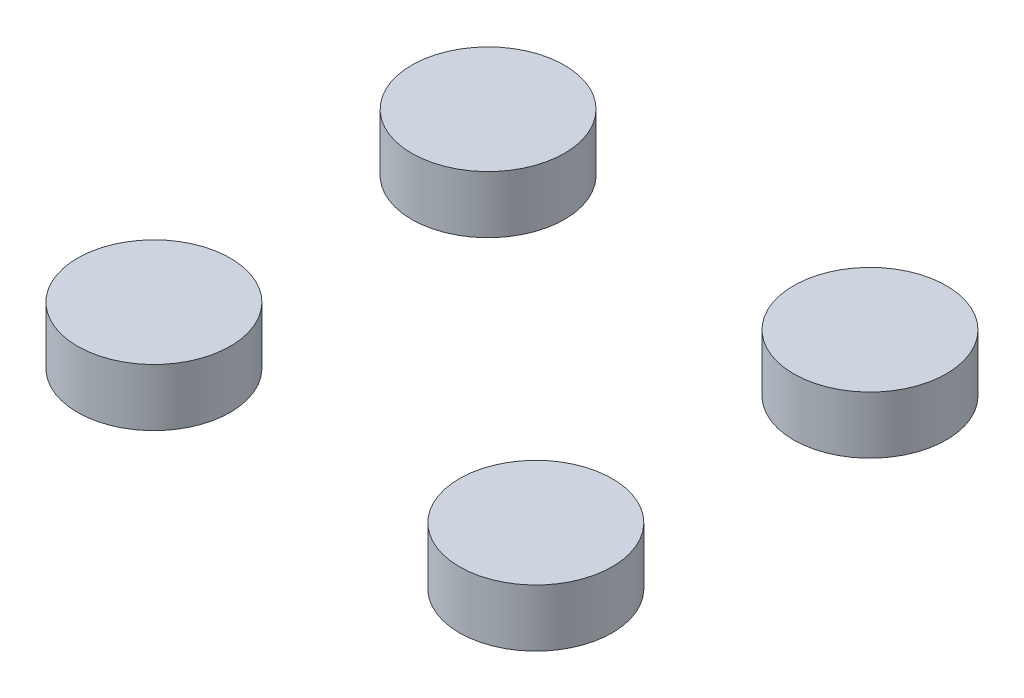
ISO-10303-21;
HEADER;
FILE_DESCRIPTION(('STEP AP214'),'2;1');
FILE_NAME('part.step','',(''),(''),'','','');
FILE_SCHEMA(('AUTOMOTIVE_DESIGN { 1 0 10303 214 1 1 1 1 }'));
ENDSEC;
DATA;
#1=APPLICATION_CONTEXT('core data for automotive mechanical design processes');
#2=APPLICATION_PROTOCOL_DEFINITION('international standard','automotive_design',2000,#1);
#3=PRODUCT_CONTEXT('',#1,'mechanical');
#4=PRODUCT('Part','Part','',(#3));
#5=PRODUCT_RELATED_PRODUCT_CATEGORY('part','',(#4));
#6=PRODUCT_DEFINITION_FORMATION('','',#4);
#7=PRODUCT_DEFINITION_CONTEXT('part definition',#1,'design');
#8=PRODUCT_DEFINITION('design','',#6,#7);
#9=PRODUCT_DEFINITION_SHAPE('','',#8);
#10=(LENGTH_UNIT() NAMED_UNIT(*) SI_UNIT(.MILLI.,.METRE.));
#11=(NAMED_UNIT(*) PLANE_ANGLE_UNIT() SI_UNIT($,.RADIAN.));
#12=(NAMED_UNIT(*) SI_UNIT($,.STERADIAN.) SOLID_ANGLE_UNIT());
#13=UNCERTAINTY_MEASURE_WITH_UNIT(LENGTH_MEASURE(1.E-05),#10,'distance_accuracy_value','');
#14=(GEOMETRIC_REPRESENTATION_CONTEXT(3) GLOBAL_UNCERTAINTY_ASSIGNED_CONTEXT((#13)) GLOBAL_UNIT_ASSIGNED_CONTEXT((#10,
#11,#12)) REPRESENTATION_CONTEXT('',''));
#15=CARTESIAN_POINT('',(0.,0.,0.));
#16=DIRECTION('',(0.,0.,1.));
#17=DIRECTION('',(1.,0.,0.));
#18=AXIS2_PLACEMENT_3D('',#15,#16,#17);
#19=CARTESIAN_POINT('',(400.,1560.,350.));
#20=DIRECTION('',(0.,-1.,0.));
#21=DIRECTION('',(0.,0.,-1.));
#22=AXIS2_PLACEMENT_3D('',#19,#20,#21);
#23=CYLINDRICAL_SURFACE('',#22,160.);
#24=CARTESIAN_POINT('',(400.,1560.,350.));
#25=DIRECTION('',(0.,1.,0.));
#26=DIRECTION('',(0.,0.,1.));
#27=AXIS2_PLACEMENT_3D('',#24,#25,#26);
#28=CIRCLE('',#27,160.);
#29=CARTESIAN_POINT('',(400.,1560.,510.));
#30=VERTEX_POINT('',#29);
#31=EDGE_CURVE('E11',#30,#30,#28,.T.);
#32=ORIENTED_EDGE('',*,*,#31,.F.);
#33=EDGE_LOOP('',(#32));
#34=FACE_BOUND('',#33,.T.);
#35=CARTESIAN_POINT('',(400.,1440.,350.));
#36=DIRECTION('',(0.,1.,0.));
#37=DIRECTION('',(0.,0.,1.));
#38=AXIS2_PLACEMENT_3D('',#35,#36,#37);
#39=CIRCLE('',#38,160.);
#40=CARTESIAN_POINT('',(400.,1440.,510.));
#41=VERTEX_POINT('',#40);
#42=EDGE_CURVE('E47',#41,#41,#39,.T.);
#43=ORIENTED_EDGE('',*,*,#42,.T.);
#44=EDGE_LOOP('',(#43));
#45=FACE_BOUND('',#44,.T.);
#46=ADVANCED_FACE('F46',(#34,#45),#23,.T.);
#47=CARTESIAN_POINT('',(400.,1560.,350.));
#48=DIRECTION('',(0.,1.,0.));
#49=DIRECTION('',(0.,0.,1.));
#50=AXIS2_PLACEMENT_3D('',#47,#48,#49);
#51=PLANE('',#50);
#52=ORIENTED_EDGE('',*,*,#31,.T.);
#53=EDGE_LOOP('',(#52));
#54=FACE_BOUND('',#53,.T.);
#55=ADVANCED_FACE('F61',(#54),#51,.T.);
#56=CARTESIAN_POINT('',(400.,1440.,350.));
#57=DIRECTION('',(0.,1.,0.));
#58=DIRECTION('',(0.,0.,1.));
#59=AXIS2_PLACEMENT_3D('',#56,#57,#58);
#60=PLANE('',#59);
#61=ORIENTED_EDGE('',*,*,#42,.F.);
#62=EDGE_LOOP('',(#61));
#63=FACE_BOUND('',#62,.T.);
#64=ADVANCED_FACE('F56',(#63),#60,.F.);
#65=CLOSED_SHELL('',(#46,#55,#64));
#66=MANIFOLD_SOLID_BREP('B2',#65);
#67=CARTESIAN_POINT('',(400.,1560.,-350.));
#68=DIRECTION('',(0.,-1.,0.));
#69=DIRECTION('',(0.,0.,-1.));
#70=AXIS2_PLACEMENT_3D('',#67,#68,#69);
#71=CYLINDRICAL_SURFACE('',#70,160.);
#72=CARTESIAN_POINT('',(400.,1560.,-350.));
#73=DIRECTION('',(0.,1.,0.));
#74=DIRECTION('',(0.,0.,1.));
#75=AXIS2_PLACEMENT_3D('',#72,#73,#74);
#76=CIRCLE('',#75,160.);
#77=CARTESIAN_POINT('',(400.,1560.,-190.));
#78=VERTEX_POINT('',#77);
#79=EDGE_CURVE('E44',#78,#78,#76,.T.);
#80=ORIENTED_EDGE('',*,*,#79,.F.);
#81=EDGE_LOOP('',(#80));
#82=FACE_BOUND('',#81,.T.);
#83=CARTESIAN_POINT('',(400.,1440.,-350.));
#84=DIRECTION('',(0.,1.,0.));
#85=DIRECTION('',(0.,0.,1.));
#86=AXIS2_PLACEMENT_3D('',#83,#84,#85);
#87=CIRCLE('',#86,160.);
#88=CARTESIAN_POINT('',(400.,1440.,-190.));
#89=VERTEX_POINT('',#88);
#90=EDGE_CURVE('E98',#89,#89,#87,.T.);
#91=ORIENTED_EDGE('',*,*,#90,.T.);
#92=EDGE_LOOP('',(#91));
#93=FACE_BOUND('',#92,.T.);
#94=ADVANCED_FACE('F92',(#82,#93),#71,.T.);
#95=CARTESIAN_POINT('',(400.,1560.,-350.));
#96=DIRECTION('',(0.,1.,0.));
#97=DIRECTION('',(0.,0.,1.));
#98=AXIS2_PLACEMENT_3D('',#95,#96,#97);
#99=PLANE('',#98);
#100=ORIENTED_EDGE('',*,*,#79,.T.);
#101=EDGE_LOOP('',(#100));
#102=FACE_BOUND('',#101,.T.);
#103=ADVANCED_FACE('F109',(#102),#99,.T.);
#104=CARTESIAN_POINT('',(400.,1440.,-350.));
#105=DIRECTION('',(0.,1.,0.));
#106=DIRECTION('',(0.,0.,1.));
#107=AXIS2_PLACEMENT_3D('',#104,#105,#106);
#108=PLANE('',#107);
#109=ORIENTED_EDGE('',*,*,#90,.F.);
#110=EDGE_LOOP('',(#109));
#111=FACE_BOUND('',#110,.T.);
#112=ADVANCED_FACE('F107',(#111),#108,.F.);
#113=CLOSED_SHELL('',(#94,#103,#112));
#114=MANIFOLD_SOLID_BREP('B6',#113);
#115=CARTESIAN_POINT('',(-400.,1560.,350.));
#116=DIRECTION('',(0.,-1.,0.));
#117=DIRECTION('',(0.,0.,-1.));
#118=AXIS2_PLACEMENT_3D('',#115,#116,#117);
#119=CYLINDRICAL_SURFACE('',#118,160.);
#120=CARTESIAN_POINT('',(-400.,1560.,350.));
#121=DIRECTION('',(0.,1.,0.));
#122=DIRECTION('',(0.,0.,1.));
#123=AXIS2_PLACEMENT_3D('',#120,#121,#122);
#124=CIRCLE('',#123,160.);
#125=CARTESIAN_POINT('',(-400.,1560.,510.));
#126=VERTEX_POINT('',#125);
#127=EDGE_CURVE('E94',#126,#126,#124,.T.);
#128=ORIENTED_EDGE('',*,*,#127,.F.);
#129=EDGE_LOOP('',(#128));
#130=FACE_BOUND('',#129,.T.);
#131=CARTESIAN_POINT('',(-400.,1440.,350.));
#132=DIRECTION('',(0.,1.,0.));
#133=DIRECTION('',(0.,0.,1.));
#134=AXIS2_PLACEMENT_3D('',#131,#132,#133);
#135=CIRCLE('',#134,160.);
#136=CARTESIAN_POINT('',(-400.,1440.,510.));
#137=VERTEX_POINT('',#136);
#138=EDGE_CURVE('E148',#137,#137,#135,.T.);
#139=ORIENTED_EDGE('',*,*,#138,.T.);
#140=EDGE_LOOP('',(#139));
#141=FACE_BOUND('',#140,.T.);
#142=ADVANCED_FACE('F141',(#130,#141),#119,.T.);
#143=CARTESIAN_POINT('',(-400.,1560.,350.));
#144=DIRECTION('',(0.,1.,0.));
#145=DIRECTION('',(0.,0.,1.));
#146=AXIS2_PLACEMENT_3D('',#143,#144,#145);
#147=PLANE('',#146);
#148=ORIENTED_EDGE('',*,*,#127,.T.);
#149=EDGE_LOOP('',(#148));
#150=FACE_BOUND('',#149,.T.);
#151=ADVANCED_FACE('F158',(#150),#147,.T.);
#152=CARTESIAN_POINT('',(-400.,1440.,350.));
#153=DIRECTION('',(0.,1.,0.));
#154=DIRECTION('',(0.,0.,1.));
#155=AXIS2_PLACEMENT_3D('',#152,#153,#154);
#156=PLANE('',#155);
#157=ORIENTED_EDGE('',*,*,#138,.F.);
#158=EDGE_LOOP('',(#157));
#159=FACE_BOUND('',#158,.T.);
#160=ADVANCED_FACE('F156',(#159),#156,.F.);
#161=CLOSED_SHELL('',(#142,#151,#160));
#162=MANIFOLD_SOLID_BREP('B37',#161);
#163=CARTESIAN_POINT('',(-400.,1560.,-350.));
#164=DIRECTION('',(0.,-1.,0.));
#165=DIRECTION('',(0.,0.,-1.));
#166=AXIS2_PLACEMENT_3D('',#163,#164,#165);
#167=CYLINDRICAL_SURFACE('',#166,160.);
#168=CARTESIAN_POINT('',(-400.,1560.,-350.));
#169=DIRECTION('',(0.,1.,0.));
#170=DIRECTION('',(0.,0.,1.));
#171=AXIS2_PLACEMENT_3D('',#168,#169,#170);
#172=CIRCLE('',#171,160.);
#173=CARTESIAN_POINT('',(-400.,1560.,-190.));
#174=VERTEX_POINT('',#173);
#175=EDGE_CURVE('E142',#174,#174,#172,.T.);
#176=ORIENTED_EDGE('',*,*,#175,.F.);
#177=EDGE_LOOP('',(#176));
#178=FACE_BOUND('',#177,.T.);
#179=CARTESIAN_POINT('',(-400.,1440.,-350.));
#180=DIRECTION('',(0.,1.,0.));
#181=DIRECTION('',(0.,0.,1.));
#182=AXIS2_PLACEMENT_3D('',#179,#180,#181);
#183=CIRCLE('',#182,160.);
#184=CARTESIAN_POINT('',(-400.,1440.,-190.));
#185=VERTEX_POINT('',#184);
#186=EDGE_CURVE('E190',#185,#185,#183,.T.);
#187=ORIENTED_EDGE('',*,*,#186,.T.);
#188=EDGE_LOOP('',(#187));
#189=FACE_BOUND('',#188,.T.);
#190=ADVANCED_FACE('F184',(#178,#189),#167,.T.);
#191=CARTESIAN_POINT('',(-400.,1560.,-350.));
#192=DIRECTION('',(0.,1.,0.));
#193=DIRECTION('',(0.,0.,1.));
#194=AXIS2_PLACEMENT_3D('',#191,#192,#193);
#195=PLANE('',#194);
#196=ORIENTED_EDGE('',*,*,#175,.T.);
#197=EDGE_LOOP('',(#196));
#198=FACE_BOUND('',#197,.T.);
#199=ADVANCED_FACE('F200',(#198),#195,.T.);
#200=CARTESIAN_POINT('',(-400.,1440.,-350.));
#201=DIRECTION('',(0.,1.,0.));
#202=DIRECTION('',(0.,0.,1.));
#203=AXIS2_PLACEMENT_3D('',#200,#201,#202);
#204=PLANE('',#203);
#205=ORIENTED_EDGE('',*,*,#186,.F.);
#206=EDGE_LOOP('',(#205));
#207=FACE_BOUND('',#206,.T.);
#208=ADVANCED_FACE('F197',(#207),#204,.F.);
#209=CLOSED_SHELL('',(#190,#199,#208));
#210=MANIFOLD_SOLID_BREP('B90',#209);
#211=ADVANCED_BREP_SHAPE_REPRESENTATION('',(#18,#66,#114,#162,#210),#14);
#212=SHAPE_DEFINITION_REPRESENTATION(#9,#211);
ENDSEC;
END-ISO-10303-21;
